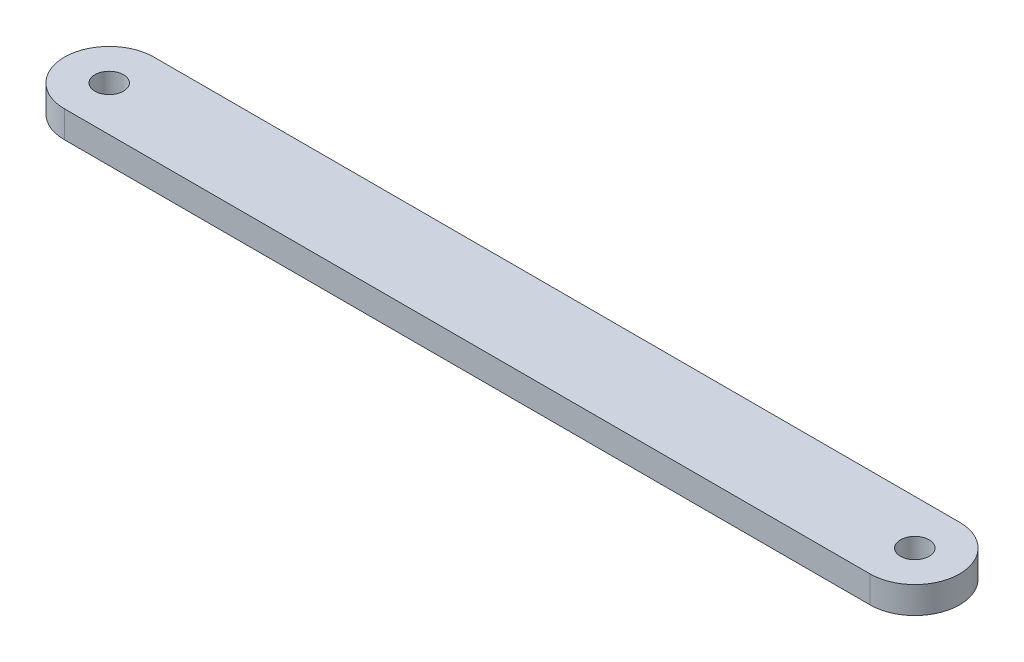
ISO-10303-21;
HEADER;
FILE_DESCRIPTION(('STEP AP214'),'2;1');
FILE_NAME('part.step','',(''),(''),'','','');
FILE_SCHEMA(('AUTOMOTIVE_DESIGN { 1 0 10303 214 1 1 1 1 }'));
ENDSEC;
DATA;
#1=APPLICATION_CONTEXT('core data for automotive mechanical design processes');
#2=APPLICATION_PROTOCOL_DEFINITION('international standard','automotive_design',2000,#1);
#3=PRODUCT_CONTEXT('',#1,'mechanical');
#4=PRODUCT('Part','Part','',(#3));
#5=PRODUCT_RELATED_PRODUCT_CATEGORY('part','',(#4));
#6=PRODUCT_DEFINITION_FORMATION('','',#4);
#7=PRODUCT_DEFINITION_CONTEXT('part definition',#1,'design');
#8=PRODUCT_DEFINITION('design','',#6,#7);
#9=PRODUCT_DEFINITION_SHAPE('','',#8);
#10=(LENGTH_UNIT() NAMED_UNIT(*) SI_UNIT(.MILLI.,.METRE.));
#11=(NAMED_UNIT(*) PLANE_ANGLE_UNIT() SI_UNIT($,.RADIAN.));
#12=(NAMED_UNIT(*) SI_UNIT($,.STERADIAN.) SOLID_ANGLE_UNIT());
#13=UNCERTAINTY_MEASURE_WITH_UNIT(LENGTH_MEASURE(1.E-05),#10,'distance_accuracy_value','');
#14=(GEOMETRIC_REPRESENTATION_CONTEXT(3) GLOBAL_UNCERTAINTY_ASSIGNED_CONTEXT((#13)) GLOBAL_UNIT_ASSIGNED_CONTEXT((#10,
#11,#12)) REPRESENTATION_CONTEXT('',''));
#15=CARTESIAN_POINT('',(0.,0.,0.));
#16=DIRECTION('',(0.,0.,1.));
#17=DIRECTION('',(1.,0.,0.));
#18=AXIS2_PLACEMENT_3D('',#15,#16,#17);
#19=CARTESIAN_POINT('',(90.,3.,0.));
#20=DIRECTION('',(0.,1.,0.));
#21=DIRECTION('',(0.,0.,1.));
#22=AXIS2_PLACEMENT_3D('',#19,#20,#21);
#23=PLANE('',#22);
#24=CARTESIAN_POINT('',(0.,3.,0.));
#25=DIRECTION('',(0.,1.,0.));
#26=DIRECTION('',(0.,0.,1.));
#27=AXIS2_PLACEMENT_3D('',#24,#25,#26);
#28=CIRCLE('',#27,1.6);
#29=CARTESIAN_POINT('',(0.,3.,1.6));
#30=VERTEX_POINT('',#29);
#31=EDGE_CURVE('E112',#30,#30,#28,.T.);
#32=ORIENTED_EDGE('',*,*,#31,.F.);
#33=EDGE_LOOP('',(#32));
#34=FACE_BOUND('',#33,.T.);
#35=CARTESIAN_POINT('',(90.,3.,0.));
#36=DIRECTION('',(0.,1.,0.));
#37=DIRECTION('',(0.,0.,1.));
#38=AXIS2_PLACEMENT_3D('',#35,#36,#37);
#39=CIRCLE('',#38,5.);
#40=CARTESIAN_POINT('',(90.,3.,5.));
#41=VERTEX_POINT('',#40);
#42=CARTESIAN_POINT('',(90.,3.,-5.));
#43=VERTEX_POINT('',#42);
#44=EDGE_CURVE('E92',#41,#43,#39,.T.);
#45=ORIENTED_EDGE('',*,*,#44,.T.);
#46=DIRECTION('',(-1.,0.,0.));
#47=VECTOR('',#46,1.);
#48=CARTESIAN_POINT('',(0.,3.,-5.));
#49=LINE('',#48,#47);
#50=CARTESIAN_POINT('',(0.,3.,-5.));
#51=VERTEX_POINT('',#50);
#52=EDGE_CURVE('E87',#43,#51,#49,.T.);
#53=ORIENTED_EDGE('',*,*,#52,.T.);
#54=CARTESIAN_POINT('',(0.,3.,0.));
#55=DIRECTION('',(0.,1.,0.));
#56=DIRECTION('',(0.,0.,1.));
#57=AXIS2_PLACEMENT_3D('',#54,#55,#56);
#58=CIRCLE('',#57,5.);
#59=CARTESIAN_POINT('',(0.,3.,5.));
#60=VERTEX_POINT('',#59);
#61=EDGE_CURVE('E90',#51,#60,#58,.T.);
#62=ORIENTED_EDGE('',*,*,#61,.T.);
#63=DIRECTION('',(1.,0.,0.));
#64=VECTOR('',#63,1.);
#65=CARTESIAN_POINT('',(0.,3.,5.));
#66=LINE('',#65,#64);
#67=EDGE_CURVE('E57',#60,#41,#66,.T.);
#68=ORIENTED_EDGE('',*,*,#67,.T.);
#69=EDGE_LOOP('',(#45,#53,#62,#68));
#70=FACE_BOUND('',#69,.T.);
#71=CARTESIAN_POINT('',(90.,3.,0.));
#72=DIRECTION('',(0.,1.,0.));
#73=DIRECTION('',(0.,0.,1.));
#74=AXIS2_PLACEMENT_3D('',#71,#72,#73);
#75=CIRCLE('',#74,1.60000000000001);
#76=CARTESIAN_POINT('',(90.,3.,1.60000000000001));
#77=VERTEX_POINT('',#76);
#78=EDGE_CURVE('E134',#77,#77,#75,.T.);
#79=ORIENTED_EDGE('',*,*,#78,.F.);
#80=EDGE_LOOP('',(#79));
#81=FACE_BOUND('',#80,.T.);
#82=ADVANCED_FACE('F39',(#34,#70,#81),#23,.T.);
#83=CARTESIAN_POINT('',(90.,0.,0.));
#84=DIRECTION('',(0.,1.,0.));
#85=DIRECTION('',(0.,0.,1.));
#86=AXIS2_PLACEMENT_3D('',#83,#84,#85);
#87=PLANE('',#86);
#88=CARTESIAN_POINT('',(90.,0.,0.));
#89=DIRECTION('',(0.,1.,0.));
#90=DIRECTION('',(0.,0.,1.));
#91=AXIS2_PLACEMENT_3D('',#88,#89,#90);
#92=CIRCLE('',#91,5.);
#93=CARTESIAN_POINT('',(90.,0.,5.));
#94=VERTEX_POINT('',#93);
#95=CARTESIAN_POINT('',(90.,0.,-5.));
#96=VERTEX_POINT('',#95);
#97=EDGE_CURVE('E108',#94,#96,#92,.T.);
#98=ORIENTED_EDGE('',*,*,#97,.F.);
#99=DIRECTION('',(1.,0.,0.));
#100=VECTOR('',#99,1.);
#101=CARTESIAN_POINT('',(0.,0.,5.));
#102=LINE('',#101,#100);
#103=CARTESIAN_POINT('',(0.,0.,5.));
#104=VERTEX_POINT('',#103);
#105=EDGE_CURVE('E80',#104,#94,#102,.T.);
#106=ORIENTED_EDGE('',*,*,#105,.F.);
#107=CARTESIAN_POINT('',(0.,0.,0.));
#108=DIRECTION('',(0.,1.,0.));
#109=DIRECTION('',(0.,0.,1.));
#110=AXIS2_PLACEMENT_3D('',#107,#108,#109);
#111=CIRCLE('',#110,5.);
#112=CARTESIAN_POINT('',(0.,0.,-5.));
#113=VERTEX_POINT('',#112);
#114=EDGE_CURVE('E74',#113,#104,#111,.T.);
#115=ORIENTED_EDGE('',*,*,#114,.F.);
#116=DIRECTION('',(-1.,0.,0.));
#117=VECTOR('',#116,1.);
#118=CARTESIAN_POINT('',(0.,0.,-5.));
#119=LINE('',#118,#117);
#120=EDGE_CURVE('E97',#96,#113,#119,.T.);
#121=ORIENTED_EDGE('',*,*,#120,.F.);
#122=EDGE_LOOP('',(#98,#106,#115,#121));
#123=FACE_BOUND('',#122,.T.);
#124=CARTESIAN_POINT('',(0.,0.,0.));
#125=DIRECTION('',(0.,1.,0.));
#126=DIRECTION('',(0.,0.,1.));
#127=AXIS2_PLACEMENT_3D('',#124,#125,#126);
#128=CIRCLE('',#127,1.6);
#129=CARTESIAN_POINT('',(0.,0.,1.6));
#130=VERTEX_POINT('',#129);
#131=EDGE_CURVE('E130',#130,#130,#128,.T.);
#132=ORIENTED_EDGE('',*,*,#131,.T.);
#133=EDGE_LOOP('',(#132));
#134=FACE_BOUND('',#133,.T.);
#135=CARTESIAN_POINT('',(90.,0.,0.));
#136=DIRECTION('',(0.,1.,0.));
#137=DIRECTION('',(0.,0.,1.));
#138=AXIS2_PLACEMENT_3D('',#135,#136,#137);
#139=CIRCLE('',#138,1.60000000000001);
#140=CARTESIAN_POINT('',(90.,0.,1.60000000000001));
#141=VERTEX_POINT('',#140);
#142=EDGE_CURVE('E138',#141,#141,#139,.T.);
#143=ORIENTED_EDGE('',*,*,#142,.T.);
#144=EDGE_LOOP('',(#143));
#145=FACE_BOUND('',#144,.T.);
#146=ADVANCED_FACE('F125',(#123,#134,#145),#87,.F.);
#147=CARTESIAN_POINT('',(90.,3.,0.));
#148=DIRECTION('',(0.,-1.,0.));
#149=DIRECTION('',(0.,0.,-1.));
#150=AXIS2_PLACEMENT_3D('',#147,#148,#149);
#151=CYLINDRICAL_SURFACE('',#150,5.);
#152=ORIENTED_EDGE('',*,*,#97,.T.);
#153=DIRECTION('',(0.,-1.,0.));
#154=VECTOR('',#153,1.);
#155=CARTESIAN_POINT('',(90.,3.,-5.));
#156=LINE('',#155,#154);
#157=EDGE_CURVE('E11',#43,#96,#156,.T.);
#158=ORIENTED_EDGE('',*,*,#157,.F.);
#159=ORIENTED_EDGE('',*,*,#44,.F.);
#160=DIRECTION('',(0.,-1.,0.));
#161=VECTOR('',#160,1.);
#162=CARTESIAN_POINT('',(90.,3.,5.));
#163=LINE('',#162,#161);
#164=EDGE_CURVE('E104',#41,#94,#163,.T.);
#165=ORIENTED_EDGE('',*,*,#164,.T.);
#166=EDGE_LOOP('',(#152,#158,#159,#165));
#167=FACE_BOUND('',#166,.T.);
#168=ADVANCED_FACE('F41',(#167),#151,.T.);
#169=CARTESIAN_POINT('',(0.,3.,-5.));
#170=DIRECTION('',(0.,0.,1.));
#171=DIRECTION('',(1.,0.,0.));
#172=AXIS2_PLACEMENT_3D('',#169,#170,#171);
#173=PLANE('',#172);
#174=ORIENTED_EDGE('',*,*,#120,.T.);
#175=DIRECTION('',(0.,-1.,0.));
#176=VECTOR('',#175,1.);
#177=CARTESIAN_POINT('',(0.,3.,-5.));
#178=LINE('',#177,#176);
#179=EDGE_CURVE('E49',#51,#113,#178,.T.);
#180=ORIENTED_EDGE('',*,*,#179,.F.);
#181=ORIENTED_EDGE('',*,*,#52,.F.);
#182=ORIENTED_EDGE('',*,*,#157,.T.);
#183=EDGE_LOOP('',(#174,#180,#181,#182));
#184=FACE_BOUND('',#183,.T.);
#185=ADVANCED_FACE('F96',(#184),#173,.F.);
#186=CARTESIAN_POINT('',(0.,3.,0.));
#187=DIRECTION('',(0.,-1.,0.));
#188=DIRECTION('',(0.,0.,-1.));
#189=AXIS2_PLACEMENT_3D('',#186,#187,#188);
#190=CYLINDRICAL_SURFACE('',#189,5.);
#191=ORIENTED_EDGE('',*,*,#114,.T.);
#192=DIRECTION('',(0.,-1.,0.));
#193=VECTOR('',#192,1.);
#194=CARTESIAN_POINT('',(0.,3.,5.));
#195=LINE('',#194,#193);
#196=EDGE_CURVE('E99',#60,#104,#195,.T.);
#197=ORIENTED_EDGE('',*,*,#196,.F.);
#198=ORIENTED_EDGE('',*,*,#61,.F.);
#199=ORIENTED_EDGE('',*,*,#179,.T.);
#200=EDGE_LOOP('',(#191,#197,#198,#199));
#201=FACE_BOUND('',#200,.T.);
#202=ADVANCED_FACE('F100',(#201),#190,.T.);
#203=CARTESIAN_POINT('',(0.,3.,5.));
#204=DIRECTION('',(0.,0.,-1.));
#205=DIRECTION('',(-1.,0.,0.));
#206=AXIS2_PLACEMENT_3D('',#203,#204,#205);
#207=PLANE('',#206);
#208=ORIENTED_EDGE('',*,*,#105,.T.);
#209=ORIENTED_EDGE('',*,*,#164,.F.);
#210=ORIENTED_EDGE('',*,*,#67,.F.);
#211=ORIENTED_EDGE('',*,*,#196,.T.);
#212=EDGE_LOOP('',(#208,#209,#210,#211));
#213=FACE_BOUND('',#212,.T.);
#214=ADVANCED_FACE('F122',(#213),#207,.F.);
#215=CARTESIAN_POINT('',(0.,3.,0.));
#216=DIRECTION('',(0.,-1.,0.));
#217=DIRECTION('',(0.,0.,-1.));
#218=AXIS2_PLACEMENT_3D('',#215,#216,#217);
#219=CYLINDRICAL_SURFACE('',#218,1.6);
#220=ORIENTED_EDGE('',*,*,#31,.T.);
#221=EDGE_LOOP('',(#220));
#222=FACE_BOUND('',#221,.T.);
#223=ORIENTED_EDGE('',*,*,#131,.F.);
#224=EDGE_LOOP('',(#223));
#225=FACE_BOUND('',#224,.T.);
#226=ADVANCED_FACE('F157',(#222,#225),#219,.F.);
#227=CARTESIAN_POINT('',(90.,3.,0.));
#228=DIRECTION('',(0.,-1.,0.));
#229=DIRECTION('',(0.,0.,-1.));
#230=AXIS2_PLACEMENT_3D('',#227,#228,#229);
#231=CYLINDRICAL_SURFACE('',#230,1.60000000000001);
#232=ORIENTED_EDGE('',*,*,#78,.T.);
#233=EDGE_LOOP('',(#232));
#234=FACE_BOUND('',#233,.T.);
#235=ORIENTED_EDGE('',*,*,#142,.F.);
#236=EDGE_LOOP('',(#235));
#237=FACE_BOUND('',#236,.T.);
#238=ADVANCED_FACE('F146',(#234,#237),#231,.F.);
#239=CLOSED_SHELL('',(#82,#146,#168,#185,#202,#214,#226,#238));
#240=MANIFOLD_SOLID_BREP('B2',#239);
#241=ADVANCED_BREP_SHAPE_REPRESENTATION('',(#18,#240),#14);
#242=SHAPE_DEFINITION_REPRESENTATION(#9,#241);
ENDSEC;
END-ISO-10303-21;
